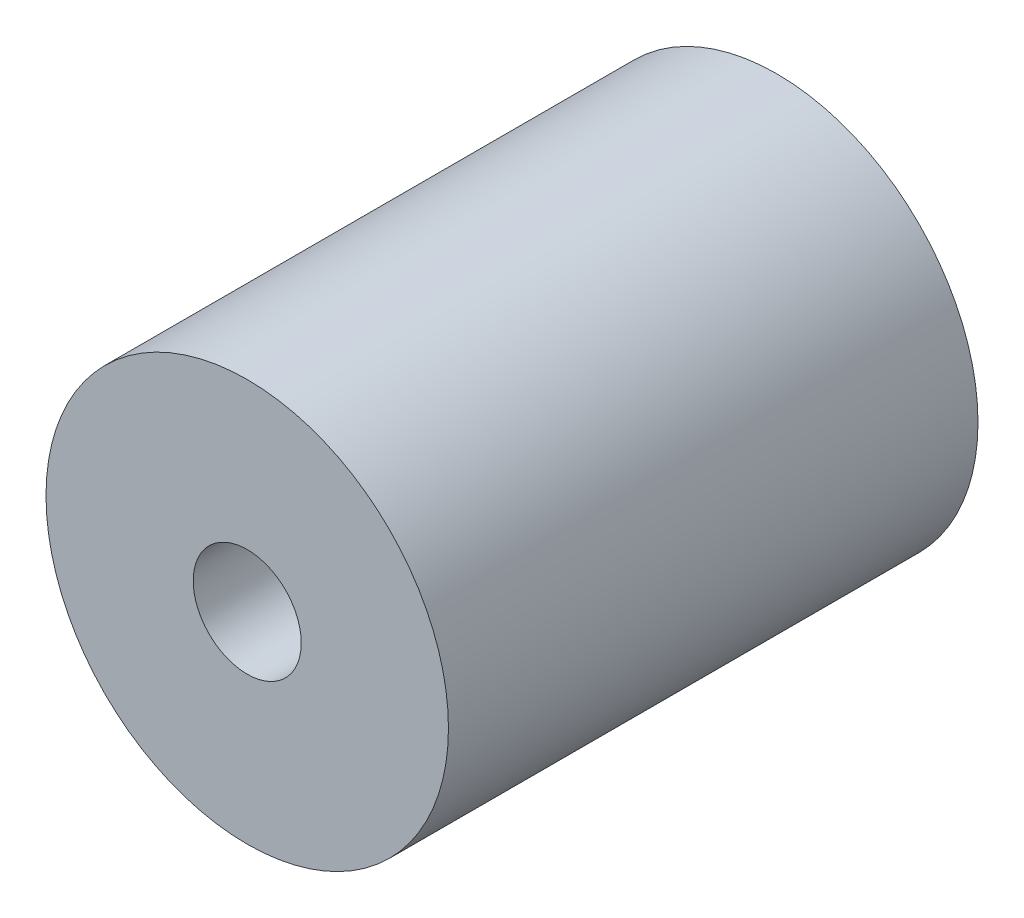
ISO-10303-21;
HEADER;
FILE_DESCRIPTION(('STEP AP214'),'2;1');
FILE_NAME('part.step','',(''),(''),'','','');
FILE_SCHEMA(('AUTOMOTIVE_DESIGN { 1 0 10303 214 1 1 1 1 }'));
ENDSEC;
DATA;
#1=APPLICATION_CONTEXT('core data for automotive mechanical design processes');
#2=APPLICATION_PROTOCOL_DEFINITION('international standard','automotive_design',2000,#1);
#3=PRODUCT_CONTEXT('',#1,'mechanical');
#4=PRODUCT('Part','Part','',(#3));
#5=PRODUCT_RELATED_PRODUCT_CATEGORY('part','',(#4));
#6=PRODUCT_DEFINITION_FORMATION('','',#4);
#7=PRODUCT_DEFINITION_CONTEXT('part definition',#1,'design');
#8=PRODUCT_DEFINITION('design','',#6,#7);
#9=PRODUCT_DEFINITION_SHAPE('','',#8);
#10=(LENGTH_UNIT() NAMED_UNIT(*) SI_UNIT(.MILLI.,.METRE.));
#11=(NAMED_UNIT(*) PLANE_ANGLE_UNIT() SI_UNIT($,.RADIAN.));
#12=(NAMED_UNIT(*) SI_UNIT($,.STERADIAN.) SOLID_ANGLE_UNIT());
#13=UNCERTAINTY_MEASURE_WITH_UNIT(LENGTH_MEASURE(1.E-05),#10,'distance_accuracy_value','');
#14=(GEOMETRIC_REPRESENTATION_CONTEXT(3) GLOBAL_UNCERTAINTY_ASSIGNED_CONTEXT((#13)) GLOBAL_UNIT_ASSIGNED_CONTEXT((#10,
#11,#12)) REPRESENTATION_CONTEXT('',''));
#15=CARTESIAN_POINT('',(0.,0.,0.));
#16=DIRECTION('',(0.,0.,1.));
#17=DIRECTION('',(1.,0.,0.));
#18=AXIS2_PLACEMENT_3D('',#15,#16,#17);
#19=CARTESIAN_POINT('',(0.,0.,12.5));
#20=DIRECTION('',(0.,0.,1.));
#21=DIRECTION('',(1.,0.,0.));
#22=AXIS2_PLACEMENT_3D('',#19,#20,#21);
#23=PLANE('',#22);
#24=CARTESIAN_POINT('',(0.,0.,12.5));
#25=DIRECTION('',(0.,0.,1.));
#26=DIRECTION('',(1.,0.,0.));
#27=AXIS2_PLACEMENT_3D('',#24,#25,#26);
#28=CIRCLE('',#27,2.55);
#29=CARTESIAN_POINT('',(2.55,0.,12.5));
#30=VERTEX_POINT('',#29);
#31=EDGE_CURVE('E21',#30,#30,#28,.T.);
#32=ORIENTED_EDGE('',*,*,#31,.T.);
#33=EDGE_LOOP('',(#32));
#34=FACE_BOUND('',#33,.T.);
#35=CARTESIAN_POINT('',(0.,0.,12.5));
#36=DIRECTION('',(0.,0.,1.));
#37=DIRECTION('',(1.,0.,0.));
#38=AXIS2_PLACEMENT_3D('',#35,#36,#37);
#39=CIRCLE('',#38,3.05);
#40=CARTESIAN_POINT('',(3.05,0.,12.5));
#41=VERTEX_POINT('',#40);
#42=EDGE_CURVE('E9',#41,#41,#39,.T.);
#43=ORIENTED_EDGE('',*,*,#42,.F.);
#44=EDGE_LOOP('',(#43));
#45=FACE_BOUND('',#44,.T.);
#46=ADVANCED_FACE('F14',(#34,#45),#23,.F.);
#47=CARTESIAN_POINT('',(0.,0.,-1.));
#48=DIRECTION('',(0.,0.,1.));
#49=DIRECTION('',(1.,0.,0.));
#50=AXIS2_PLACEMENT_3D('',#47,#48,#49);
#51=CYLINDRICAL_SURFACE('',#50,3.05);
#52=ORIENTED_EDGE('',*,*,#42,.T.);
#53=EDGE_LOOP('',(#52));
#54=FACE_BOUND('',#53,.T.);
#55=CARTESIAN_POINT('',(0.,0.,0.));
#56=DIRECTION('',(0.,0.,1.));
#57=DIRECTION('',(1.,0.,0.));
#58=AXIS2_PLACEMENT_3D('',#55,#56,#57);
#59=CIRCLE('',#58,3.05);
#60=CARTESIAN_POINT('',(3.05,0.,0.));
#61=VERTEX_POINT('',#60);
#62=EDGE_CURVE('E30',#61,#61,#59,.T.);
#63=ORIENTED_EDGE('',*,*,#62,.F.);
#64=EDGE_LOOP('',(#63));
#65=FACE_BOUND('',#64,.T.);
#66=ADVANCED_FACE('F70',(#54,#65),#51,.F.);
#67=CARTESIAN_POINT('',(0.,0.,12.5));
#68=DIRECTION('',(0.,0.,1.));
#69=DIRECTION('',(1.,0.,0.));
#70=AXIS2_PLACEMENT_3D('',#67,#68,#69);
#71=CYLINDRICAL_SURFACE('',#70,2.55);
#72=CARTESIAN_POINT('',(0.,0.,25.));
#73=DIRECTION('',(0.,0.,1.));
#74=DIRECTION('',(1.,0.,0.));
#75=AXIS2_PLACEMENT_3D('',#72,#73,#74);
#76=CIRCLE('',#75,2.55);
#77=CARTESIAN_POINT('',(2.55,0.,25.));
#78=VERTEX_POINT('',#77);
#79=EDGE_CURVE('E38',#78,#78,#76,.T.);
#80=ORIENTED_EDGE('',*,*,#79,.T.);
#81=EDGE_LOOP('',(#80));
#82=FACE_BOUND('',#81,.T.);
#83=ORIENTED_EDGE('',*,*,#31,.F.);
#84=EDGE_LOOP('',(#83));
#85=FACE_BOUND('',#84,.T.);
#86=ADVANCED_FACE('F74',(#82,#85),#71,.F.);
#87=CARTESIAN_POINT('',(0.,0.,0.));
#88=DIRECTION('',(0.,0.,1.));
#89=DIRECTION('',(1.,0.,0.));
#90=AXIS2_PLACEMENT_3D('',#87,#88,#89);
#91=PLANE('',#90);
#92=ORIENTED_EDGE('',*,*,#62,.T.);
#93=EDGE_LOOP('',(#92));
#94=FACE_BOUND('',#93,.T.);
#95=CARTESIAN_POINT('',(0.,0.,0.));
#96=DIRECTION('',(0.,0.,1.));
#97=DIRECTION('',(1.,0.,0.));
#98=AXIS2_PLACEMENT_3D('',#95,#96,#97);
#99=CIRCLE('',#98,9.5);
#100=CARTESIAN_POINT('',(9.5,0.,0.));
#101=VERTEX_POINT('',#100);
#102=EDGE_CURVE('E41',#101,#101,#99,.T.);
#103=ORIENTED_EDGE('',*,*,#102,.F.);
#104=EDGE_LOOP('',(#103));
#105=FACE_BOUND('',#104,.T.);
#106=ADVANCED_FACE('F66',(#94,#105),#91,.F.);
#107=CARTESIAN_POINT('',(0.,0.,25.));
#108=DIRECTION('',(0.,0.,1.));
#109=DIRECTION('',(1.,0.,0.));
#110=AXIS2_PLACEMENT_3D('',#107,#108,#109);
#111=PLANE('',#110);
#112=ORIENTED_EDGE('',*,*,#79,.F.);
#113=EDGE_LOOP('',(#112));
#114=FACE_BOUND('',#113,.T.);
#115=CARTESIAN_POINT('',(0.,0.,25.));
#116=DIRECTION('',(0.,0.,1.));
#117=DIRECTION('',(1.,0.,0.));
#118=AXIS2_PLACEMENT_3D('',#115,#116,#117);
#119=CIRCLE('',#118,9.5);
#120=CARTESIAN_POINT('',(9.5,0.,25.));
#121=VERTEX_POINT('',#120);
#122=EDGE_CURVE('E48',#121,#121,#119,.T.);
#123=ORIENTED_EDGE('',*,*,#122,.T.);
#124=EDGE_LOOP('',(#123));
#125=FACE_BOUND('',#124,.T.);
#126=ADVANCED_FACE('F57',(#114,#125),#111,.T.);
#127=CARTESIAN_POINT('',(0.,0.,0.));
#128=DIRECTION('',(0.,0.,1.));
#129=DIRECTION('',(1.,0.,0.));
#130=AXIS2_PLACEMENT_3D('',#127,#128,#129);
#131=CYLINDRICAL_SURFACE('',#130,9.5);
#132=ORIENTED_EDGE('',*,*,#122,.F.);
#133=EDGE_LOOP('',(#132));
#134=FACE_BOUND('',#133,.T.);
#135=ORIENTED_EDGE('',*,*,#102,.T.);
#136=EDGE_LOOP('',(#135));
#137=FACE_BOUND('',#136,.T.);
#138=ADVANCED_FACE('F59',(#134,#137),#131,.T.);
#139=CLOSED_SHELL('',(#46,#66,#86,#106,#126,#138));
#140=MANIFOLD_SOLID_BREP('B1',#139);
#141=ADVANCED_BREP_SHAPE_REPRESENTATION('',(#18,#140),#14);
#142=SHAPE_DEFINITION_REPRESENTATION(#9,#141);
ENDSEC;
END-ISO-10303-21;
